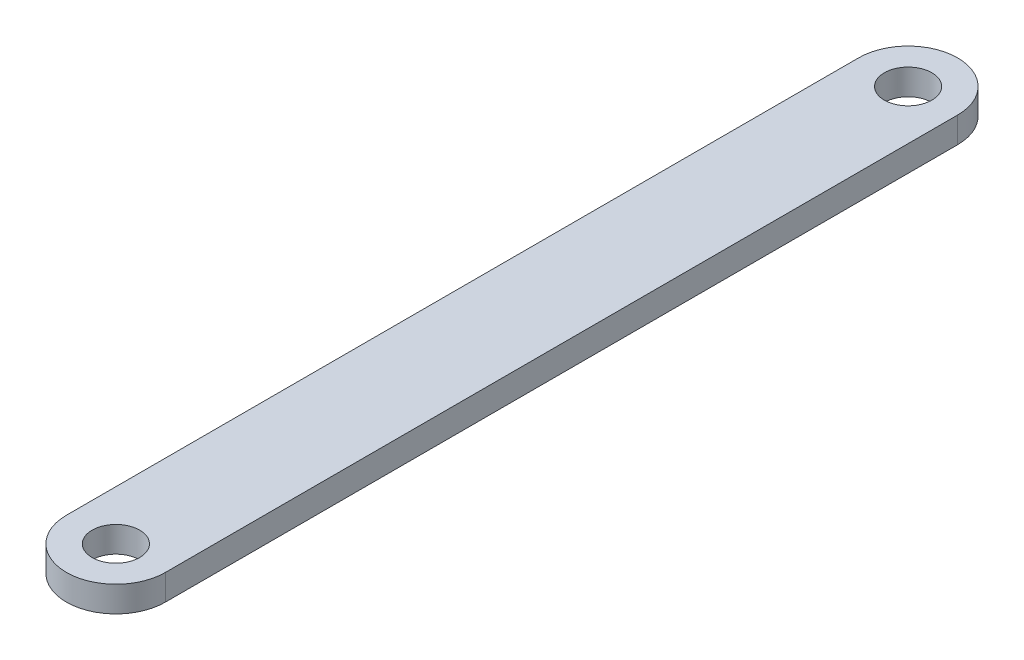
ISO-10303-21;
HEADER;
FILE_DESCRIPTION(('STEP AP214'),'2;1');
FILE_NAME('part.step','',(''),(''),'','','');
FILE_SCHEMA(('AUTOMOTIVE_DESIGN { 1 0 10303 214 1 1 1 1 }'));
ENDSEC;
DATA;
#1=APPLICATION_CONTEXT('core data for automotive mechanical design processes');
#2=APPLICATION_PROTOCOL_DEFINITION('international standard','automotive_design',2000,#1);
#3=PRODUCT_CONTEXT('',#1,'mechanical');
#4=PRODUCT('Part','Part','',(#3));
#5=PRODUCT_RELATED_PRODUCT_CATEGORY('part','',(#4));
#6=PRODUCT_DEFINITION_FORMATION('','',#4);
#7=PRODUCT_DEFINITION_CONTEXT('part definition',#1,'design');
#8=PRODUCT_DEFINITION('design','',#6,#7);
#9=PRODUCT_DEFINITION_SHAPE('','',#8);
#10=(LENGTH_UNIT() NAMED_UNIT(*) SI_UNIT(.MILLI.,.METRE.));
#11=(NAMED_UNIT(*) PLANE_ANGLE_UNIT() SI_UNIT($,.RADIAN.));
#12=(NAMED_UNIT(*) SI_UNIT($,.STERADIAN.) SOLID_ANGLE_UNIT());
#13=UNCERTAINTY_MEASURE_WITH_UNIT(LENGTH_MEASURE(1.E-05),#10,'distance_accuracy_value','');
#14=(GEOMETRIC_REPRESENTATION_CONTEXT(3) GLOBAL_UNCERTAINTY_ASSIGNED_CONTEXT((#13)) GLOBAL_UNIT_ASSIGNED_CONTEXT((#10,
#11,#12)) REPRESENTATION_CONTEXT('',''));
#15=CARTESIAN_POINT('',(0.,0.,0.));
#16=DIRECTION('',(0.,0.,1.));
#17=DIRECTION('',(1.,0.,0.));
#18=AXIS2_PLACEMENT_3D('',#15,#16,#17);
#19=CARTESIAN_POINT('',(0.,3.25,-100.));
#20=DIRECTION('',(0.,1.,0.));
#21=DIRECTION('',(0.,0.,1.));
#22=AXIS2_PLACEMENT_3D('',#19,#20,#21);
#23=PLANE('',#22);
#24=CARTESIAN_POINT('',(0.,3.25,-100.));
#25=DIRECTION('',(0.,1.,0.));
#26=DIRECTION('',(0.,0.,1.));
#27=AXIS2_PLACEMENT_3D('',#24,#25,#26);
#28=CIRCLE('',#27,6.);
#29=CARTESIAN_POINT('',(0.,3.25,-106.));
#30=VERTEX_POINT('',#29);
#31=EDGE_CURVE('E118',#30,#30,#28,.T.);
#32=ORIENTED_EDGE('',*,*,#31,.F.);
#33=EDGE_LOOP('',(#32));
#34=FACE_BOUND('',#33,.T.);
#35=CARTESIAN_POINT('',(0.,3.25,-100.));
#36=DIRECTION('',(0.,1.,0.));
#37=DIRECTION('',(0.,0.,1.));
#38=AXIS2_PLACEMENT_3D('',#35,#36,#37);
#39=CIRCLE('',#38,12.5);
#40=CARTESIAN_POINT('',(12.4999999999999,3.25,-100.));
#41=VERTEX_POINT('',#40);
#42=CARTESIAN_POINT('',(-12.5,3.25,-100.));
#43=VERTEX_POINT('',#42);
#44=EDGE_CURVE('E98',#41,#43,#39,.T.);
#45=ORIENTED_EDGE('',*,*,#44,.T.);
#46=DIRECTION('',(0.,0.,1.));
#47=VECTOR('',#46,1.);
#48=CARTESIAN_POINT('',(-12.5,3.25,-100.));
#49=LINE('',#48,#47);
#50=CARTESIAN_POINT('',(-12.4999999999999,3.25,100.));
#51=VERTEX_POINT('',#50);
#52=EDGE_CURVE('E93',#43,#51,#49,.T.);
#53=ORIENTED_EDGE('',*,*,#52,.T.);
#54=CARTESIAN_POINT('',(0.,3.25,100.));
#55=DIRECTION('',(0.,1.,0.));
#56=DIRECTION('',(0.,0.,1.));
#57=AXIS2_PLACEMENT_3D('',#54,#55,#56);
#58=CIRCLE('',#57,12.5);
#59=CARTESIAN_POINT('',(12.5,3.25,100.));
#60=VERTEX_POINT('',#59);
#61=EDGE_CURVE('E96',#51,#60,#58,.T.);
#62=ORIENTED_EDGE('',*,*,#61,.T.);
#63=DIRECTION('',(0.,0.,-1.));
#64=VECTOR('',#63,1.);
#65=CARTESIAN_POINT('',(12.4999999999999,3.25,-100.));
#66=LINE('',#65,#64);
#67=EDGE_CURVE('E63',#60,#41,#66,.T.);
#68=ORIENTED_EDGE('',*,*,#67,.T.);
#69=EDGE_LOOP('',(#45,#53,#62,#68));
#70=FACE_BOUND('',#69,.T.);
#71=CARTESIAN_POINT('',(0.,3.25,100.));
#72=DIRECTION('',(0.,1.,0.));
#73=DIRECTION('',(0.,0.,1.));
#74=AXIS2_PLACEMENT_3D('',#71,#72,#73);
#75=CIRCLE('',#74,6.);
#76=CARTESIAN_POINT('',(0.,3.25,94.));
#77=VERTEX_POINT('',#76);
#78=EDGE_CURVE('E140',#77,#77,#75,.T.);
#79=ORIENTED_EDGE('',*,*,#78,.F.);
#80=EDGE_LOOP('',(#79));
#81=FACE_BOUND('',#80,.T.);
#82=ADVANCED_FACE('F45',(#34,#70,#81),#23,.T.);
#83=CARTESIAN_POINT('',(0.,-3.25,-100.));
#84=DIRECTION('',(0.,1.,0.));
#85=DIRECTION('',(0.,0.,1.));
#86=AXIS2_PLACEMENT_3D('',#83,#84,#85);
#87=PLANE('',#86);
#88=CARTESIAN_POINT('',(0.,-3.25,-100.));
#89=DIRECTION('',(0.,1.,0.));
#90=DIRECTION('',(0.,0.,1.));
#91=AXIS2_PLACEMENT_3D('',#88,#89,#90);
#92=CIRCLE('',#91,12.5);
#93=CARTESIAN_POINT('',(12.4999999999999,-3.25,-100.));
#94=VERTEX_POINT('',#93);
#95=CARTESIAN_POINT('',(-12.5,-3.25,-100.));
#96=VERTEX_POINT('',#95);
#97=EDGE_CURVE('E114',#94,#96,#92,.T.);
#98=ORIENTED_EDGE('',*,*,#97,.F.);
#99=DIRECTION('',(0.,0.,-1.));
#100=VECTOR('',#99,1.);
#101=CARTESIAN_POINT('',(12.4999999999999,-3.25,-100.));
#102=LINE('',#101,#100);
#103=CARTESIAN_POINT('',(12.5,-3.25,100.));
#104=VERTEX_POINT('',#103);
#105=EDGE_CURVE('E86',#104,#94,#102,.T.);
#106=ORIENTED_EDGE('',*,*,#105,.F.);
#107=CARTESIAN_POINT('',(0.,-3.25,100.));
#108=DIRECTION('',(0.,1.,0.));
#109=DIRECTION('',(0.,0.,1.));
#110=AXIS2_PLACEMENT_3D('',#107,#108,#109);
#111=CIRCLE('',#110,12.5);
#112=CARTESIAN_POINT('',(-12.4999999999999,-3.25,100.));
#113=VERTEX_POINT('',#112);
#114=EDGE_CURVE('E80',#113,#104,#111,.T.);
#115=ORIENTED_EDGE('',*,*,#114,.F.);
#116=DIRECTION('',(0.,0.,1.));
#117=VECTOR('',#116,1.);
#118=CARTESIAN_POINT('',(-12.5,-3.25,-100.));
#119=LINE('',#118,#117);
#120=EDGE_CURVE('E103',#96,#113,#119,.T.);
#121=ORIENTED_EDGE('',*,*,#120,.F.);
#122=EDGE_LOOP('',(#98,#106,#115,#121));
#123=FACE_BOUND('',#122,.T.);
#124=CARTESIAN_POINT('',(0.,-3.25,-100.));
#125=DIRECTION('',(0.,1.,0.));
#126=DIRECTION('',(0.,0.,1.));
#127=AXIS2_PLACEMENT_3D('',#124,#125,#126);
#128=CIRCLE('',#127,6.);
#129=CARTESIAN_POINT('',(0.,-3.25,-106.));
#130=VERTEX_POINT('',#129);
#131=EDGE_CURVE('E136',#130,#130,#128,.T.);
#132=ORIENTED_EDGE('',*,*,#131,.T.);
#133=EDGE_LOOP('',(#132));
#134=FACE_BOUND('',#133,.T.);
#135=CARTESIAN_POINT('',(0.,-3.25,100.));
#136=DIRECTION('',(0.,1.,0.));
#137=DIRECTION('',(0.,0.,1.));
#138=AXIS2_PLACEMENT_3D('',#135,#136,#137);
#139=CIRCLE('',#138,6.);
#140=CARTESIAN_POINT('',(0.,-3.25,94.));
#141=VERTEX_POINT('',#140);
#142=EDGE_CURVE('E144',#141,#141,#139,.T.);
#143=ORIENTED_EDGE('',*,*,#142,.T.);
#144=EDGE_LOOP('',(#143));
#145=FACE_BOUND('',#144,.T.);
#146=ADVANCED_FACE('F131',(#123,#134,#145),#87,.F.);
#147=CARTESIAN_POINT('',(0.,3.25,-100.));
#148=DIRECTION('',(0.,-1.,0.));
#149=DIRECTION('',(0.,0.,-1.));
#150=AXIS2_PLACEMENT_3D('',#147,#148,#149);
#151=CYLINDRICAL_SURFACE('',#150,12.5);
#152=ORIENTED_EDGE('',*,*,#97,.T.);
#153=DIRECTION('',(0.,-1.,0.));
#154=VECTOR('',#153,1.);
#155=CARTESIAN_POINT('',(-12.5,3.25,-100.));
#156=LINE('',#155,#154);
#157=EDGE_CURVE('E11',#43,#96,#156,.T.);
#158=ORIENTED_EDGE('',*,*,#157,.F.);
#159=ORIENTED_EDGE('',*,*,#44,.F.);
#160=DIRECTION('',(0.,-1.,0.));
#161=VECTOR('',#160,1.);
#162=CARTESIAN_POINT('',(12.4999999999999,3.25,-100.));
#163=LINE('',#162,#161);
#164=EDGE_CURVE('E110',#41,#94,#163,.T.);
#165=ORIENTED_EDGE('',*,*,#164,.T.);
#166=EDGE_LOOP('',(#152,#158,#159,#165));
#167=FACE_BOUND('',#166,.T.);
#168=ADVANCED_FACE('F47',(#167),#151,.T.);
#169=CARTESIAN_POINT('',(-12.5,3.25,-100.));
#170=DIRECTION('',(1.,0.,0.));
#171=DIRECTION('',(0.,0.,-1.));
#172=AXIS2_PLACEMENT_3D('',#169,#170,#171);
#173=PLANE('',#172);
#174=ORIENTED_EDGE('',*,*,#120,.T.);
#175=DIRECTION('',(0.,-1.,0.));
#176=VECTOR('',#175,1.);
#177=CARTESIAN_POINT('',(-12.4999999999999,3.25,100.));
#178=LINE('',#177,#176);
#179=EDGE_CURVE('E55',#51,#113,#178,.T.);
#180=ORIENTED_EDGE('',*,*,#179,.F.);
#181=ORIENTED_EDGE('',*,*,#52,.F.);
#182=ORIENTED_EDGE('',*,*,#157,.T.);
#183=EDGE_LOOP('',(#174,#180,#181,#182));
#184=FACE_BOUND('',#183,.T.);
#185=ADVANCED_FACE('F102',(#184),#173,.F.);
#186=CARTESIAN_POINT('',(0.,3.25,100.));
#187=DIRECTION('',(0.,-1.,0.));
#188=DIRECTION('',(0.,0.,-1.));
#189=AXIS2_PLACEMENT_3D('',#186,#187,#188);
#190=CYLINDRICAL_SURFACE('',#189,12.5);
#191=ORIENTED_EDGE('',*,*,#114,.T.);
#192=DIRECTION('',(0.,-1.,0.));
#193=VECTOR('',#192,1.);
#194=CARTESIAN_POINT('',(12.5,3.25,100.));
#195=LINE('',#194,#193);
#196=EDGE_CURVE('E105',#60,#104,#195,.T.);
#197=ORIENTED_EDGE('',*,*,#196,.F.);
#198=ORIENTED_EDGE('',*,*,#61,.F.);
#199=ORIENTED_EDGE('',*,*,#179,.T.);
#200=EDGE_LOOP('',(#191,#197,#198,#199));
#201=FACE_BOUND('',#200,.T.);
#202=ADVANCED_FACE('F106',(#201),#190,.T.);
#203=CARTESIAN_POINT('',(12.4999999999999,3.25,-100.));
#204=DIRECTION('',(-1.,0.,0.));
#205=DIRECTION('',(0.,0.,1.));
#206=AXIS2_PLACEMENT_3D('',#203,#204,#205);
#207=PLANE('',#206);
#208=ORIENTED_EDGE('',*,*,#105,.T.);
#209=ORIENTED_EDGE('',*,*,#164,.F.);
#210=ORIENTED_EDGE('',*,*,#67,.F.);
#211=ORIENTED_EDGE('',*,*,#196,.T.);
#212=EDGE_LOOP('',(#208,#209,#210,#211));
#213=FACE_BOUND('',#212,.T.);
#214=ADVANCED_FACE('F128',(#213),#207,.F.);
#215=CARTESIAN_POINT('',(0.,3.25,-100.));
#216=DIRECTION('',(0.,-1.,0.));
#217=DIRECTION('',(0.,0.,-1.));
#218=AXIS2_PLACEMENT_3D('',#215,#216,#217);
#219=CYLINDRICAL_SURFACE('',#218,6.);
#220=CARTESIAN_POINT('',(0.,3.25,-106.));
#221=CARTESIAN_POINT('',(0.,3.18229166666667,-106.));
#222=CARTESIAN_POINT('',(0.,3.11458333333333,-106.));
#223=CARTESIAN_POINT('',(0.,2.97916666666667,-106.));
#224=CARTESIAN_POINT('',(0.,2.91145833333333,-106.));
#225=CARTESIAN_POINT('',(0.,2.77604166666667,-106.));
#226=CARTESIAN_POINT('',(0.,2.70833333333333,-106.));
#227=CARTESIAN_POINT('',(0.,2.57291666666667,-106.));
#228=CARTESIAN_POINT('',(0.,2.50520833333333,-106.));
#229=CARTESIAN_POINT('',(0.,2.36979166666667,-106.));
#230=CARTESIAN_POINT('',(0.,2.30208333333333,-106.));
#231=CARTESIAN_POINT('',(0.,2.16666666666667,-106.));
#232=CARTESIAN_POINT('',(0.,2.09895833333333,-106.));
#233=CARTESIAN_POINT('',(0.,1.96354166666667,-106.));
#234=CARTESIAN_POINT('',(0.,1.89583333333333,-106.));
#235=CARTESIAN_POINT('',(0.,1.76041666666667,-106.));
#236=CARTESIAN_POINT('',(0.,1.69270833333333,-106.));
#237=CARTESIAN_POINT('',(0.,1.55729166666667,-106.));
#238=CARTESIAN_POINT('',(0.,1.48958333333333,-106.));
#239=CARTESIAN_POINT('',(0.,1.35416666666667,-106.));
#240=CARTESIAN_POINT('',(0.,1.28645833333333,-106.));
#241=CARTESIAN_POINT('',(0.,1.15104166666667,-106.));
#242=CARTESIAN_POINT('',(0.,1.08333333333333,-106.));
#243=CARTESIAN_POINT('',(0.,0.947916666666667,-106.));
#244=CARTESIAN_POINT('',(0.,0.880208333333333,-106.));
#245=CARTESIAN_POINT('',(0.,0.744791666666667,-106.));
#246=CARTESIAN_POINT('',(0.,0.677083333333333,-106.));
#247=CARTESIAN_POINT('',(0.,0.541666666666667,-106.));
#248=CARTESIAN_POINT('',(0.,0.473958333333333,-106.));
#249=CARTESIAN_POINT('',(0.,0.338541666666667,-106.));
#250=CARTESIAN_POINT('',(0.,0.270833333333333,-106.));
#251=CARTESIAN_POINT('',(0.,0.135416666666667,-106.));
#252=CARTESIAN_POINT('',(0.,0.0677083333333334,-106.));
#253=CARTESIAN_POINT('',(0.,-0.0677083333333334,-106.));
#254=CARTESIAN_POINT('',(0.,-0.135416666666667,-106.));
#255=CARTESIAN_POINT('',(0.,-0.270833333333333,-106.));
#256=CARTESIAN_POINT('',(0.,-0.338541666666667,-106.));
#257=CARTESIAN_POINT('',(0.,-0.473958333333333,-106.));
#258=CARTESIAN_POINT('',(0.,-0.541666666666667,-106.));
#259=CARTESIAN_POINT('',(0.,-0.677083333333333,-106.));
#260=CARTESIAN_POINT('',(0.,-0.744791666666666,-106.));
#261=CARTESIAN_POINT('',(0.,-0.880208333333333,-106.));
#262=CARTESIAN_POINT('',(0.,-0.947916666666666,-106.));
#263=CARTESIAN_POINT('',(0.,-1.08333333333333,-106.));
#264=CARTESIAN_POINT('',(0.,-1.15104166666667,-106.));
#265=CARTESIAN_POINT('',(0.,-1.28645833333333,-106.));
#266=CARTESIAN_POINT('',(0.,-1.35416666666667,-106.));
#267=CARTESIAN_POINT('',(0.,-1.48958333333333,-106.));
#268=CARTESIAN_POINT('',(0.,-1.55729166666667,-106.));
#269=CARTESIAN_POINT('',(0.,-1.69270833333333,-106.));
#270=CARTESIAN_POINT('',(0.,-1.76041666666667,-106.));
#271=CARTESIAN_POINT('',(0.,-1.89583333333333,-106.));
#272=CARTESIAN_POINT('',(0.,-1.96354166666667,-106.));
#273=CARTESIAN_POINT('',(0.,-2.09895833333333,-106.));
#274=CARTESIAN_POINT('',(0.,-2.16666666666667,-106.));
#275=CARTESIAN_POINT('',(0.,-2.30208333333333,-106.));
#276=CARTESIAN_POINT('',(0.,-2.36979166666667,-106.));
#277=CARTESIAN_POINT('',(0.,-2.50520833333333,-106.));
#278=CARTESIAN_POINT('',(0.,-2.57291666666667,-106.));
#279=CARTESIAN_POINT('',(0.,-2.70833333333333,-106.));
#280=CARTESIAN_POINT('',(0.,-2.77604166666667,-106.));
#281=CARTESIAN_POINT('',(0.,-2.91145833333333,-106.));
#282=CARTESIAN_POINT('',(0.,-2.97916666666667,-106.));
#283=CARTESIAN_POINT('',(0.,-3.11458333333333,-106.));
#284=CARTESIAN_POINT('',(0.,-3.18229166666667,-106.));
#285=CARTESIAN_POINT('',(0.,-3.25,-106.));
#286=B_SPLINE_CURVE_WITH_KNOTS('',3,(#220,#221,#222,#223,#224,#225,#226,#227,#228,#229,#230,
#231,#232,#233,#234,#235,#236,#237,#238,#239,#240,#241,#242,#243,#244,#245,#246,#247,#248,#249,
#250,#251,#252,#253,#254,#255,#256,#257,#258,#259,#260,#261,#262,#263,#264,#265,#266,#267,#268,
#269,#270,#271,#272,#273,#274,#275,#276,#277,#278,#279,#280,#281,#282,#283,#284,#285),
.UNSPECIFIED.,.F.,.F.,(4,2,2,2,2,2,2,2,2,2,2,2,2,2,2,2,2,2,2,2,2,2,2,2,2,2,2,2,2,2,2,2,4),(0.,
0.203125,0.40625,0.609375,0.8125,1.015625,1.21875,1.421875,1.625,1.828125,2.03125,2.234375,
2.4375,2.640625,2.84375,3.046875,3.25,3.453125,3.65625,3.859375,4.0625,4.265625,4.46875,
4.671875,4.875,5.078125,5.28125,5.484375,5.6875,5.890625,6.09375,6.296875,6.5),.UNSPECIFIED.);
#287=EDGE_CURVE('BSEAM163',#30,#130,#286,.T.);
#288=ORIENTED_EDGE('',*,*,#31,.T.);
#289=ORIENTED_EDGE('',*,*,#131,.F.);
#290=ORIENTED_EDGE('',*,*,#287,.T.);
#291=ORIENTED_EDGE('',*,*,#287,.F.);
#292=EDGE_LOOP('',(#288,#290,#289,#291));
#293=FACE_BOUND('',#292,.T.);
#294=ADVANCED_FACE('F163',(#293),#219,.F.);
#295=CARTESIAN_POINT('',(0.,3.25,100.));
#296=DIRECTION('',(0.,-1.,0.));
#297=DIRECTION('',(0.,0.,-1.));
#298=AXIS2_PLACEMENT_3D('',#295,#296,#297);
#299=CYLINDRICAL_SURFACE('',#298,6.);
#300=CARTESIAN_POINT('',(0.,3.25,94.));
#301=CARTESIAN_POINT('',(0.,3.18229166666667,94.));
#302=CARTESIAN_POINT('',(0.,3.11458333333333,94.));
#303=CARTESIAN_POINT('',(0.,2.97916666666667,94.));
#304=CARTESIAN_POINT('',(0.,2.91145833333333,94.));
#305=CARTESIAN_POINT('',(0.,2.77604166666667,94.));
#306=CARTESIAN_POINT('',(0.,2.70833333333333,94.));
#307=CARTESIAN_POINT('',(0.,2.57291666666667,94.));
#308=CARTESIAN_POINT('',(0.,2.50520833333333,94.));
#309=CARTESIAN_POINT('',(0.,2.36979166666667,94.));
#310=CARTESIAN_POINT('',(0.,2.30208333333333,94.));
#311=CARTESIAN_POINT('',(0.,2.16666666666667,94.));
#312=CARTESIAN_POINT('',(0.,2.09895833333333,94.));
#313=CARTESIAN_POINT('',(0.,1.96354166666667,94.));
#314=CARTESIAN_POINT('',(0.,1.89583333333333,94.));
#315=CARTESIAN_POINT('',(0.,1.76041666666667,94.));
#316=CARTESIAN_POINT('',(0.,1.69270833333333,94.));
#317=CARTESIAN_POINT('',(0.,1.55729166666667,94.));
#318=CARTESIAN_POINT('',(0.,1.48958333333333,94.));
#319=CARTESIAN_POINT('',(0.,1.35416666666667,94.));
#320=CARTESIAN_POINT('',(0.,1.28645833333333,94.));
#321=CARTESIAN_POINT('',(0.,1.15104166666667,94.));
#322=CARTESIAN_POINT('',(0.,1.08333333333333,94.));
#323=CARTESIAN_POINT('',(0.,0.947916666666667,94.));
#324=CARTESIAN_POINT('',(0.,0.880208333333333,94.));
#325=CARTESIAN_POINT('',(0.,0.744791666666667,94.));
#326=CARTESIAN_POINT('',(0.,0.677083333333333,94.));
#327=CARTESIAN_POINT('',(0.,0.541666666666667,94.));
#328=CARTESIAN_POINT('',(0.,0.473958333333333,94.));
#329=CARTESIAN_POINT('',(0.,0.338541666666667,94.));
#330=CARTESIAN_POINT('',(0.,0.270833333333333,94.));
#331=CARTESIAN_POINT('',(0.,0.135416666666667,94.));
#332=CARTESIAN_POINT('',(0.,0.0677083333333334,94.));
#333=CARTESIAN_POINT('',(0.,-0.0677083333333334,94.));
#334=CARTESIAN_POINT('',(0.,-0.135416666666667,94.));
#335=CARTESIAN_POINT('',(0.,-0.270833333333333,94.));
#336=CARTESIAN_POINT('',(0.,-0.338541666666667,94.));
#337=CARTESIAN_POINT('',(0.,-0.473958333333333,94.));
#338=CARTESIAN_POINT('',(0.,-0.541666666666667,94.));
#339=CARTESIAN_POINT('',(0.,-0.677083333333333,94.));
#340=CARTESIAN_POINT('',(0.,-0.744791666666666,94.));
#341=CARTESIAN_POINT('',(0.,-0.880208333333333,94.));
#342=CARTESIAN_POINT('',(0.,-0.947916666666666,94.));
#343=CARTESIAN_POINT('',(0.,-1.08333333333333,94.));
#344=CARTESIAN_POINT('',(0.,-1.15104166666667,94.));
#345=CARTESIAN_POINT('',(0.,-1.28645833333333,94.));
#346=CARTESIAN_POINT('',(0.,-1.35416666666667,94.));
#347=CARTESIAN_POINT('',(0.,-1.48958333333333,94.));
#348=CARTESIAN_POINT('',(0.,-1.55729166666667,94.));
#349=CARTESIAN_POINT('',(0.,-1.69270833333333,94.));
#350=CARTESIAN_POINT('',(0.,-1.76041666666667,94.));
#351=CARTESIAN_POINT('',(0.,-1.89583333333333,94.));
#352=CARTESIAN_POINT('',(0.,-1.96354166666667,94.));
#353=CARTESIAN_POINT('',(0.,-2.09895833333333,94.));
#354=CARTESIAN_POINT('',(0.,-2.16666666666667,94.));
#355=CARTESIAN_POINT('',(0.,-2.30208333333333,94.));
#356=CARTESIAN_POINT('',(0.,-2.36979166666667,94.));
#357=CARTESIAN_POINT('',(0.,-2.50520833333333,94.));
#358=CARTESIAN_POINT('',(0.,-2.57291666666667,94.));
#359=CARTESIAN_POINT('',(0.,-2.70833333333333,94.));
#360=CARTESIAN_POINT('',(0.,-2.77604166666667,94.));
#361=CARTESIAN_POINT('',(0.,-2.91145833333333,94.));
#362=CARTESIAN_POINT('',(0.,-2.97916666666667,94.));
#363=CARTESIAN_POINT('',(0.,-3.11458333333333,94.));
#364=CARTESIAN_POINT('',(0.,-3.18229166666667,94.));
#365=CARTESIAN_POINT('',(0.,-3.25,94.));
#366=B_SPLINE_CURVE_WITH_KNOTS('',3,(#300,#301,#302,#303,#304,#305,#306,#307,#308,#309,#310,
#311,#312,#313,#314,#315,#316,#317,#318,#319,#320,#321,#322,#323,#324,#325,#326,#327,#328,#329,
#330,#331,#332,#333,#334,#335,#336,#337,#338,#339,#340,#341,#342,#343,#344,#345,#346,#347,#348,
#349,#350,#351,#352,#353,#354,#355,#356,#357,#358,#359,#360,#361,#362,#363,#364,#365),
.UNSPECIFIED.,.F.,.F.,(4,2,2,2,2,2,2,2,2,2,2,2,2,2,2,2,2,2,2,2,2,2,2,2,2,2,2,2,2,2,2,2,4),(0.,
0.203125,0.40625,0.609375,0.8125,1.015625,1.21875,1.421875,1.625,1.828125,2.03125,2.234375,
2.4375,2.640625,2.84375,3.046875,3.25,3.453125,3.65625,3.859375,4.0625,4.265625,4.46875,
4.671875,4.875,5.078125,5.28125,5.484375,5.6875,5.890625,6.09375,6.296875,6.5),.UNSPECIFIED.);
#367=EDGE_CURVE('BSEAM152',#77,#141,#366,.T.);
#368=ORIENTED_EDGE('',*,*,#78,.T.);
#369=ORIENTED_EDGE('',*,*,#142,.F.);
#370=ORIENTED_EDGE('',*,*,#367,.T.);
#371=ORIENTED_EDGE('',*,*,#367,.F.);
#372=EDGE_LOOP('',(#368,#370,#369,#371));
#373=FACE_BOUND('',#372,.T.);
#374=ADVANCED_FACE('F152',(#373),#299,.F.);
#375=CLOSED_SHELL('',(#82,#146,#168,#185,#202,#214,#294,#374));
#376=MANIFOLD_SOLID_BREP('B2',#375);
#377=ADVANCED_BREP_SHAPE_REPRESENTATION('',(#18,#376),#14);
#378=SHAPE_DEFINITION_REPRESENTATION(#9,#377);
ENDSEC;
END-ISO-10303-21;
